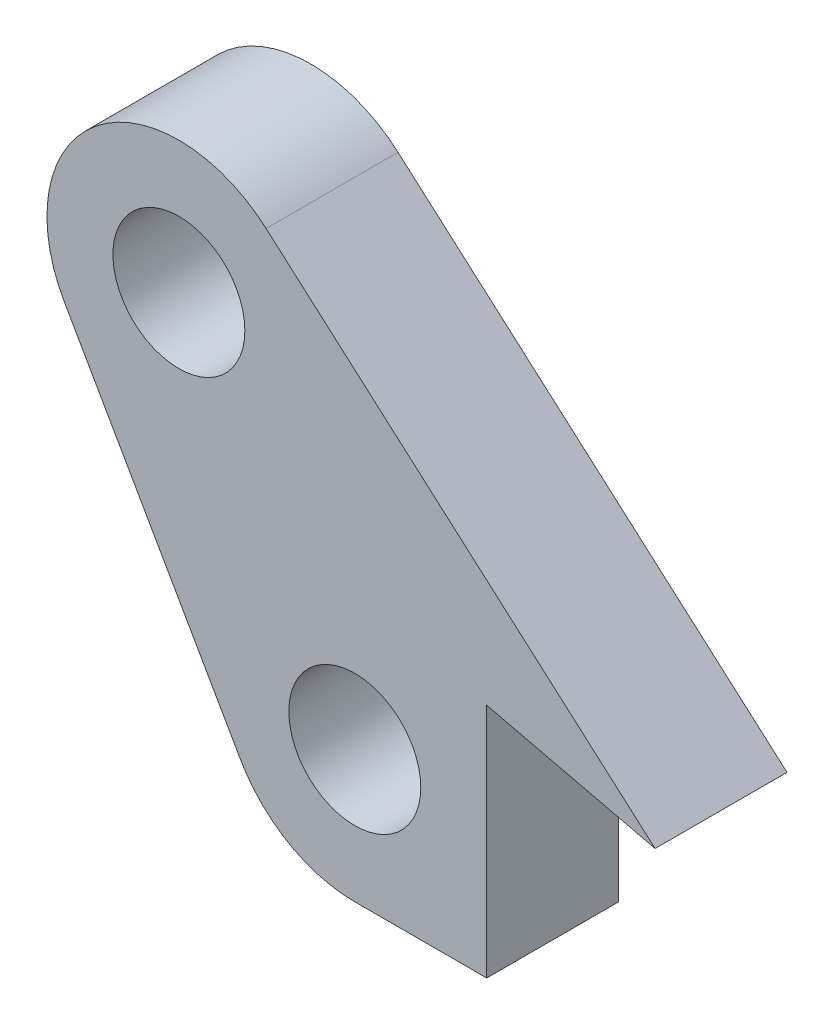
ISO-10303-21;
HEADER;
FILE_DESCRIPTION(('STEP AP214'),'2;1');
FILE_NAME('part.step','',(''),(''),'','','');
FILE_SCHEMA(('AUTOMOTIVE_DESIGN { 1 0 10303 214 1 1 1 1 }'));
ENDSEC;
DATA;
#1=APPLICATION_CONTEXT('core data for automotive mechanical design processes');
#2=APPLICATION_PROTOCOL_DEFINITION('international standard','automotive_design',2000,#1);
#3=PRODUCT_CONTEXT('',#1,'mechanical');
#4=PRODUCT('Part','Part','',(#3));
#5=PRODUCT_RELATED_PRODUCT_CATEGORY('part','',(#4));
#6=PRODUCT_DEFINITION_FORMATION('','',#4);
#7=PRODUCT_DEFINITION_CONTEXT('part definition',#1,'design');
#8=PRODUCT_DEFINITION('design','',#6,#7);
#9=PRODUCT_DEFINITION_SHAPE('','',#8);
#10=(LENGTH_UNIT() NAMED_UNIT(*) SI_UNIT(.MILLI.,.METRE.));
#11=(NAMED_UNIT(*) PLANE_ANGLE_UNIT() SI_UNIT($,.RADIAN.));
#12=(NAMED_UNIT(*) SI_UNIT($,.STERADIAN.) SOLID_ANGLE_UNIT());
#13=UNCERTAINTY_MEASURE_WITH_UNIT(LENGTH_MEASURE(1.E-05),#10,'distance_accuracy_value','');
#14=(GEOMETRIC_REPRESENTATION_CONTEXT(3) GLOBAL_UNCERTAINTY_ASSIGNED_CONTEXT((#13)) GLOBAL_UNIT_ASSIGNED_CONTEXT((#10,
#11,#12)) REPRESENTATION_CONTEXT('',''));
#15=CARTESIAN_POINT('',(0.,0.,0.));
#16=DIRECTION('',(0.,0.,1.));
#17=DIRECTION('',(1.,0.,0.));
#18=AXIS2_PLACEMENT_3D('',#15,#16,#17);
#19=CARTESIAN_POINT('',(-13.7934590365499,3.,3.));
#20=DIRECTION('',(0.,0.,1.));
#21=DIRECTION('',(1.,0.,0.));
#22=AXIS2_PLACEMENT_3D('',#19,#20,#21);
#23=PLANE('',#22);
#24=CARTESIAN_POINT('',(-17.7934590365499,10.,3.));
#25=DIRECTION('',(0.,0.,1.));
#26=DIRECTION('',(1.,0.,0.));
#27=AXIS2_PLACEMENT_3D('',#24,#25,#26);
#28=CIRCLE('',#27,1.5);
#29=CARTESIAN_POINT('',(-16.2934590365499,10.,3.));
#30=VERTEX_POINT('',#29);
#31=EDGE_CURVE('E130',#30,#30,#28,.T.);
#32=ORIENTED_EDGE('',*,*,#31,.F.);
#33=EDGE_LOOP('',(#32));
#34=FACE_BOUND('',#33,.T.);
#35=CARTESIAN_POINT('',(-13.7934590365499,3.,3.));
#36=DIRECTION('',(0.,0.,1.));
#37=DIRECTION('',(1.,0.,0.));
#38=AXIS2_PLACEMENT_3D('',#35,#36,#37);
#39=CIRCLE('',#38,3.);
#40=CARTESIAN_POINT('',(-16.3981884629233,1.5115831849295,3.));
#41=VERTEX_POINT('',#40);
#42=CARTESIAN_POINT('',(-13.7934590365499,0.,3.));
#43=VERTEX_POINT('',#42);
#44=EDGE_CURVE('E139',#41,#43,#39,.T.);
#45=ORIENTED_EDGE('',*,*,#44,.T.);
#46=DIRECTION('',(1.,0.,0.));
#47=VECTOR('',#46,1.);
#48=CARTESIAN_POINT('',(-13.7934590365499,0.,3.));
#49=LINE('',#48,#47);
#50=CARTESIAN_POINT('',(-10.7934590365499,0.,3.));
#51=VERTEX_POINT('',#50);
#52=EDGE_CURVE('E92',#43,#51,#49,.T.);
#53=ORIENTED_EDGE('',*,*,#52,.T.);
#54=DIRECTION('',(0.,1.,0.));
#55=VECTOR('',#54,1.);
#56=CARTESIAN_POINT('',(-10.7934590365499,0.,3.));
#57=LINE('',#56,#55);
#58=CARTESIAN_POINT('',(-10.7934590365499,5.37170824512628,3.));
#59=VERTEX_POINT('',#58);
#60=EDGE_CURVE('E151',#51,#59,#57,.T.);
#61=ORIENTED_EDGE('',*,*,#60,.T.);
#62=DIRECTION('',(0.97300851082104,-0.230769230769231,0.));
#63=VECTOR('',#62,1.);
#64=CARTESIAN_POINT('',(-10.7934590365499,5.37170824512628,3.));
#65=LINE('',#64,#63);
#66=CARTESIAN_POINT('',(-6.96547448707744,4.46382199330629,3.));
#67=VERTEX_POINT('',#66);
#68=EDGE_CURVE('E108',#59,#67,#65,.T.);
#69=ORIENTED_EDGE('',*,*,#68,.T.);
#70=DIRECTION('',(-0.750555704198129,0.660807184355354,0.));
#71=VECTOR('',#70,1.);
#72=CARTESIAN_POINT('',(-6.96547448707744,4.46382199330629,3.));
#73=LINE('',#72,#71);
#74=CARTESIAN_POINT('',(-15.8110374834839,12.2516671125944,3.));
#75=VERTEX_POINT('',#74);
#76=EDGE_CURVE('E102',#67,#75,#73,.T.);
#77=ORIENTED_EDGE('',*,*,#76,.T.);
#78=CARTESIAN_POINT('',(-17.7934590365499,10.,3.));
#79=DIRECTION('',(0.,0.,1.));
#80=DIRECTION('',(1.,0.,0.));
#81=AXIS2_PLACEMENT_3D('',#78,#79,#80);
#82=CIRCLE('',#81,3.);
#83=CARTESIAN_POINT('',(-20.3981884629233,8.5115831849295,3.));
#84=VERTEX_POINT('',#83);
#85=EDGE_CURVE('E106',#75,#84,#82,.T.);
#86=ORIENTED_EDGE('',*,*,#85,.T.);
#87=DIRECTION('',(0.496138938356834,-0.868243142124459,0.));
#88=VECTOR('',#87,1.);
#89=CARTESIAN_POINT('',(-20.3981884629233,8.5115831849295,3.));
#90=LINE('',#89,#88);
#91=EDGE_CURVE('E52',#84,#41,#90,.T.);
#92=ORIENTED_EDGE('',*,*,#91,.T.);
#93=EDGE_LOOP('',(#45,#53,#61,#69,#77,#86,#92));
#94=FACE_BOUND('',#93,.T.);
#95=CARTESIAN_POINT('',(-13.7934590365499,3.,3.));
#96=DIRECTION('',(0.,0.,1.));
#97=DIRECTION('',(1.,0.,0.));
#98=AXIS2_PLACEMENT_3D('',#95,#96,#97);
#99=CIRCLE('',#98,1.5);
#100=CARTESIAN_POINT('',(-12.2934590365499,3.,3.));
#101=VERTEX_POINT('',#100);
#102=EDGE_CURVE('E166',#101,#101,#99,.T.);
#103=ORIENTED_EDGE('',*,*,#102,.F.);
#104=EDGE_LOOP('',(#103));
#105=FACE_BOUND('',#104,.T.);
#106=ADVANCED_FACE('F35',(#34,#94,#105),#23,.T.);
#107=CARTESIAN_POINT('',(-13.7934590365499,3.,0.));
#108=DIRECTION('',(0.,0.,1.));
#109=DIRECTION('',(1.,0.,0.));
#110=AXIS2_PLACEMENT_3D('',#107,#108,#109);
#111=PLANE('',#110);
#112=CARTESIAN_POINT('',(-13.7934590365499,3.,0.));
#113=DIRECTION('',(0.,0.,1.));
#114=DIRECTION('',(1.,0.,0.));
#115=AXIS2_PLACEMENT_3D('',#112,#113,#114);
#116=CIRCLE('',#115,3.);
#117=CARTESIAN_POINT('',(-16.3981884629233,1.5115831849295,0.));
#118=VERTEX_POINT('',#117);
#119=CARTESIAN_POINT('',(-13.7934590365499,0.,0.));
#120=VERTEX_POINT('',#119);
#121=EDGE_CURVE('E126',#118,#120,#116,.T.);
#122=ORIENTED_EDGE('',*,*,#121,.F.);
#123=DIRECTION('',(0.496138938356834,-0.868243142124459,0.));
#124=VECTOR('',#123,1.);
#125=CARTESIAN_POINT('',(-20.3981884629233,8.5115831849295,0.));
#126=LINE('',#125,#124);
#127=CARTESIAN_POINT('',(-20.3981884629233,8.5115831849295,0.));
#128=VERTEX_POINT('',#127);
#129=EDGE_CURVE('E84',#128,#118,#126,.T.);
#130=ORIENTED_EDGE('',*,*,#129,.F.);
#131=CARTESIAN_POINT('',(-17.7934590365499,10.,0.));
#132=DIRECTION('',(0.,0.,1.));
#133=DIRECTION('',(1.,0.,0.));
#134=AXIS2_PLACEMENT_3D('',#131,#132,#133);
#135=CIRCLE('',#134,3.);
#136=CARTESIAN_POINT('',(-15.8110374834839,12.2516671125944,0.));
#137=VERTEX_POINT('',#136);
#138=EDGE_CURVE('E78',#137,#128,#135,.T.);
#139=ORIENTED_EDGE('',*,*,#138,.F.);
#140=DIRECTION('',(-0.750555704198129,0.660807184355354,0.));
#141=VECTOR('',#140,1.);
#142=CARTESIAN_POINT('',(-6.96547448707744,4.46382199330629,0.));
#143=LINE('',#142,#141);
#144=CARTESIAN_POINT('',(-6.96547448707744,4.46382199330629,0.));
#145=VERTEX_POINT('',#144);
#146=EDGE_CURVE('E116',#145,#137,#143,.T.);
#147=ORIENTED_EDGE('',*,*,#146,.F.);
#148=DIRECTION('',(0.97300851082104,-0.230769230769231,0.));
#149=VECTOR('',#148,1.);
#150=CARTESIAN_POINT('',(-10.7934590365499,5.37170824512628,0.));
#151=LINE('',#150,#149);
#152=CARTESIAN_POINT('',(-10.7934590365499,5.37170824512628,0.));
#153=VERTEX_POINT('',#152);
#154=EDGE_CURVE('E134',#153,#145,#151,.T.);
#155=ORIENTED_EDGE('',*,*,#154,.F.);
#156=DIRECTION('',(0.,1.,0.));
#157=VECTOR('',#156,1.);
#158=CARTESIAN_POINT('',(-10.7934590365499,0.,0.));
#159=LINE('',#158,#157);
#160=CARTESIAN_POINT('',(-10.7934590365499,0.,0.));
#161=VERTEX_POINT('',#160);
#162=EDGE_CURVE('E132',#161,#153,#159,.T.);
#163=ORIENTED_EDGE('',*,*,#162,.F.);
#164=DIRECTION('',(1.,0.,0.));
#165=VECTOR('',#164,1.);
#166=CARTESIAN_POINT('',(-13.7934590365499,0.,0.));
#167=LINE('',#166,#165);
#168=EDGE_CURVE('E129',#120,#161,#167,.T.);
#169=ORIENTED_EDGE('',*,*,#168,.F.);
#170=EDGE_LOOP('',(#122,#130,#139,#147,#155,#163,#169));
#171=FACE_BOUND('',#170,.T.);
#172=CARTESIAN_POINT('',(-17.7934590365499,10.,0.));
#173=DIRECTION('',(0.,0.,1.));
#174=DIRECTION('',(1.,0.,0.));
#175=AXIS2_PLACEMENT_3D('',#172,#173,#174);
#176=CIRCLE('',#175,1.5);
#177=CARTESIAN_POINT('',(-16.2934590365499,10.,0.));
#178=VERTEX_POINT('',#177);
#179=EDGE_CURVE('E163',#178,#178,#176,.T.);
#180=ORIENTED_EDGE('',*,*,#179,.T.);
#181=EDGE_LOOP('',(#180));
#182=FACE_BOUND('',#181,.T.);
#183=CARTESIAN_POINT('',(-13.7934590365499,3.,0.));
#184=DIRECTION('',(0.,0.,1.));
#185=DIRECTION('',(1.,0.,0.));
#186=AXIS2_PLACEMENT_3D('',#183,#184,#185);
#187=CIRCLE('',#186,1.5);
#188=CARTESIAN_POINT('',(-12.2934590365499,3.,0.));
#189=VERTEX_POINT('',#188);
#190=EDGE_CURVE('E169',#189,#189,#187,.T.);
#191=ORIENTED_EDGE('',*,*,#190,.T.);
#192=EDGE_LOOP('',(#191));
#193=FACE_BOUND('',#192,.T.);
#194=ADVANCED_FACE('F155',(#171,#182,#193),#111,.F.);
#195=CARTESIAN_POINT('',(-13.7934590365499,3.,3.));
#196=DIRECTION('',(0.,0.,-1.));
#197=DIRECTION('',(-1.,0.,0.));
#198=AXIS2_PLACEMENT_3D('',#195,#196,#197);
#199=CYLINDRICAL_SURFACE('',#198,3.);
#200=ORIENTED_EDGE('',*,*,#121,.T.);
#201=DIRECTION('',(0.,0.,-1.));
#202=VECTOR('',#201,1.);
#203=CARTESIAN_POINT('',(-13.7934590365499,0.,3.));
#204=LINE('',#203,#202);
#205=EDGE_CURVE('E11',#43,#120,#204,.T.);
#206=ORIENTED_EDGE('',*,*,#205,.F.);
#207=ORIENTED_EDGE('',*,*,#44,.F.);
#208=DIRECTION('',(0.,0.,-1.));
#209=VECTOR('',#208,1.);
#210=CARTESIAN_POINT('',(-16.3981884629233,1.5115831849295,3.));
#211=LINE('',#210,#209);
#212=EDGE_CURVE('E122',#41,#118,#211,.T.);
#213=ORIENTED_EDGE('',*,*,#212,.T.);
#214=EDGE_LOOP('',(#200,#206,#207,#213));
#215=FACE_BOUND('',#214,.T.);
#216=ADVANCED_FACE('F37',(#215),#199,.T.);
#217=CARTESIAN_POINT('',(-13.7934590365499,0.,3.));
#218=DIRECTION('',(0.,1.,0.));
#219=DIRECTION('',(0.,0.,1.));
#220=AXIS2_PLACEMENT_3D('',#217,#218,#219);
#221=PLANE('',#220);
#222=ORIENTED_EDGE('',*,*,#168,.T.);
#223=DIRECTION('',(0.,0.,-1.));
#224=VECTOR('',#223,1.);
#225=CARTESIAN_POINT('',(-10.7934590365499,0.,3.));
#226=LINE('',#225,#224);
#227=EDGE_CURVE('E44',#51,#161,#226,.T.);
#228=ORIENTED_EDGE('',*,*,#227,.F.);
#229=ORIENTED_EDGE('',*,*,#52,.F.);
#230=ORIENTED_EDGE('',*,*,#205,.T.);
#231=EDGE_LOOP('',(#222,#228,#229,#230));
#232=FACE_BOUND('',#231,.T.);
#233=ADVANCED_FACE('F199',(#232),#221,.F.);
#234=CARTESIAN_POINT('',(-10.7934590365499,0.,3.));
#235=DIRECTION('',(-1.,0.,0.));
#236=DIRECTION('',(0.,0.,1.));
#237=AXIS2_PLACEMENT_3D('',#234,#235,#236);
#238=PLANE('',#237);
#239=ORIENTED_EDGE('',*,*,#162,.T.);
#240=DIRECTION('',(0.,0.,-1.));
#241=VECTOR('',#240,1.);
#242=CARTESIAN_POINT('',(-10.7934590365499,5.37170824512628,3.));
#243=LINE('',#242,#241);
#244=EDGE_CURVE('E143',#59,#153,#243,.T.);
#245=ORIENTED_EDGE('',*,*,#244,.F.);
#246=ORIENTED_EDGE('',*,*,#60,.F.);
#247=ORIENTED_EDGE('',*,*,#227,.T.);
#248=EDGE_LOOP('',(#239,#245,#246,#247));
#249=FACE_BOUND('',#248,.T.);
#250=ADVANCED_FACE('F149',(#249),#238,.F.);
#251=CARTESIAN_POINT('',(-10.7934590365499,5.37170824512628,3.));
#252=DIRECTION('',(0.230769230769231,0.97300851082104,0.));
#253=DIRECTION('',(-0.97300851082104,0.230769230769231,0.));
#254=AXIS2_PLACEMENT_3D('',#251,#252,#253);
#255=PLANE('',#254);
#256=ORIENTED_EDGE('',*,*,#154,.T.);
#257=DIRECTION('',(0.,0.,-1.));
#258=VECTOR('',#257,1.);
#259=CARTESIAN_POINT('',(-6.96547448707744,4.46382199330629,3.));
#260=LINE('',#259,#258);
#261=EDGE_CURVE('E117',#67,#145,#260,.T.);
#262=ORIENTED_EDGE('',*,*,#261,.F.);
#263=ORIENTED_EDGE('',*,*,#68,.F.);
#264=ORIENTED_EDGE('',*,*,#244,.T.);
#265=EDGE_LOOP('',(#256,#262,#263,#264));
#266=FACE_BOUND('',#265,.T.);
#267=ADVANCED_FACE('F158',(#266),#255,.F.);
#268=CARTESIAN_POINT('',(-6.96547448707744,4.46382199330629,3.));
#269=DIRECTION('',(-0.660807184355354,-0.750555704198129,0.));
#270=DIRECTION('',(0.750555704198129,-0.660807184355354,0.));
#271=AXIS2_PLACEMENT_3D('',#268,#269,#270);
#272=PLANE('',#271);
#273=ORIENTED_EDGE('',*,*,#146,.T.);
#274=DIRECTION('',(0.,0.,-1.));
#275=VECTOR('',#274,1.);
#276=CARTESIAN_POINT('',(-15.8110374834839,12.2516671125944,3.));
#277=LINE('',#276,#275);
#278=EDGE_CURVE('E113',#75,#137,#277,.T.);
#279=ORIENTED_EDGE('',*,*,#278,.F.);
#280=ORIENTED_EDGE('',*,*,#76,.F.);
#281=ORIENTED_EDGE('',*,*,#261,.T.);
#282=EDGE_LOOP('',(#273,#279,#280,#281));
#283=FACE_BOUND('',#282,.T.);
#284=ADVANCED_FACE('F114',(#283),#272,.F.);
#285=CARTESIAN_POINT('',(-17.7934590365499,10.,3.));
#286=DIRECTION('',(0.,0.,-1.));
#287=DIRECTION('',(-1.,0.,0.));
#288=AXIS2_PLACEMENT_3D('',#285,#286,#287);
#289=CYLINDRICAL_SURFACE('',#288,3.);
#290=ORIENTED_EDGE('',*,*,#138,.T.);
#291=DIRECTION('',(0.,0.,-1.));
#292=VECTOR('',#291,1.);
#293=CARTESIAN_POINT('',(-20.3981884629233,8.5115831849295,3.));
#294=LINE('',#293,#292);
#295=EDGE_CURVE('E118',#84,#128,#294,.T.);
#296=ORIENTED_EDGE('',*,*,#295,.F.);
#297=ORIENTED_EDGE('',*,*,#85,.F.);
#298=ORIENTED_EDGE('',*,*,#278,.T.);
#299=EDGE_LOOP('',(#290,#296,#297,#298));
#300=FACE_BOUND('',#299,.T.);
#301=ADVANCED_FACE('F120',(#300),#289,.T.);
#302=CARTESIAN_POINT('',(-20.3981884629233,8.5115831849295,3.));
#303=DIRECTION('',(0.868243142124459,0.496138938356834,0.));
#304=DIRECTION('',(-0.496138938356834,0.868243142124459,0.));
#305=AXIS2_PLACEMENT_3D('',#302,#303,#304);
#306=PLANE('',#305);
#307=ORIENTED_EDGE('',*,*,#129,.T.);
#308=ORIENTED_EDGE('',*,*,#212,.F.);
#309=ORIENTED_EDGE('',*,*,#91,.F.);
#310=ORIENTED_EDGE('',*,*,#295,.T.);
#311=EDGE_LOOP('',(#307,#308,#309,#310));
#312=FACE_BOUND('',#311,.T.);
#313=ADVANCED_FACE('F189',(#312),#306,.F.);
#314=CARTESIAN_POINT('',(-17.7934590365499,10.,3.));
#315=DIRECTION('',(0.,0.,-1.));
#316=DIRECTION('',(-1.,0.,0.));
#317=AXIS2_PLACEMENT_3D('',#314,#315,#316);
#318=CYLINDRICAL_SURFACE('',#317,1.5);
#319=ORIENTED_EDGE('',*,*,#31,.T.);
#320=EDGE_LOOP('',(#319));
#321=FACE_BOUND('',#320,.T.);
#322=ORIENTED_EDGE('',*,*,#179,.F.);
#323=EDGE_LOOP('',(#322));
#324=FACE_BOUND('',#323,.T.);
#325=ADVANCED_FACE('F186',(#321,#324),#318,.F.);
#326=CARTESIAN_POINT('',(-13.7934590365499,3.,3.));
#327=DIRECTION('',(0.,0.,-1.));
#328=DIRECTION('',(-1.,0.,0.));
#329=AXIS2_PLACEMENT_3D('',#326,#327,#328);
#330=CYLINDRICAL_SURFACE('',#329,1.5);
#331=ORIENTED_EDGE('',*,*,#102,.T.);
#332=EDGE_LOOP('',(#331));
#333=FACE_BOUND('',#332,.T.);
#334=ORIENTED_EDGE('',*,*,#190,.F.);
#335=EDGE_LOOP('',(#334));
#336=FACE_BOUND('',#335,.T.);
#337=ADVANCED_FACE('F175',(#333,#336),#330,.F.);
#338=CLOSED_SHELL('',(#106,#194,#216,#233,#250,#267,#284,#301,#313,#325,#337));
#339=MANIFOLD_SOLID_BREP('B2',#338);
#340=ADVANCED_BREP_SHAPE_REPRESENTATION('',(#18,#339),#14);
#341=SHAPE_DEFINITION_REPRESENTATION(#9,#340);
ENDSEC;
END-ISO-10303-21;
